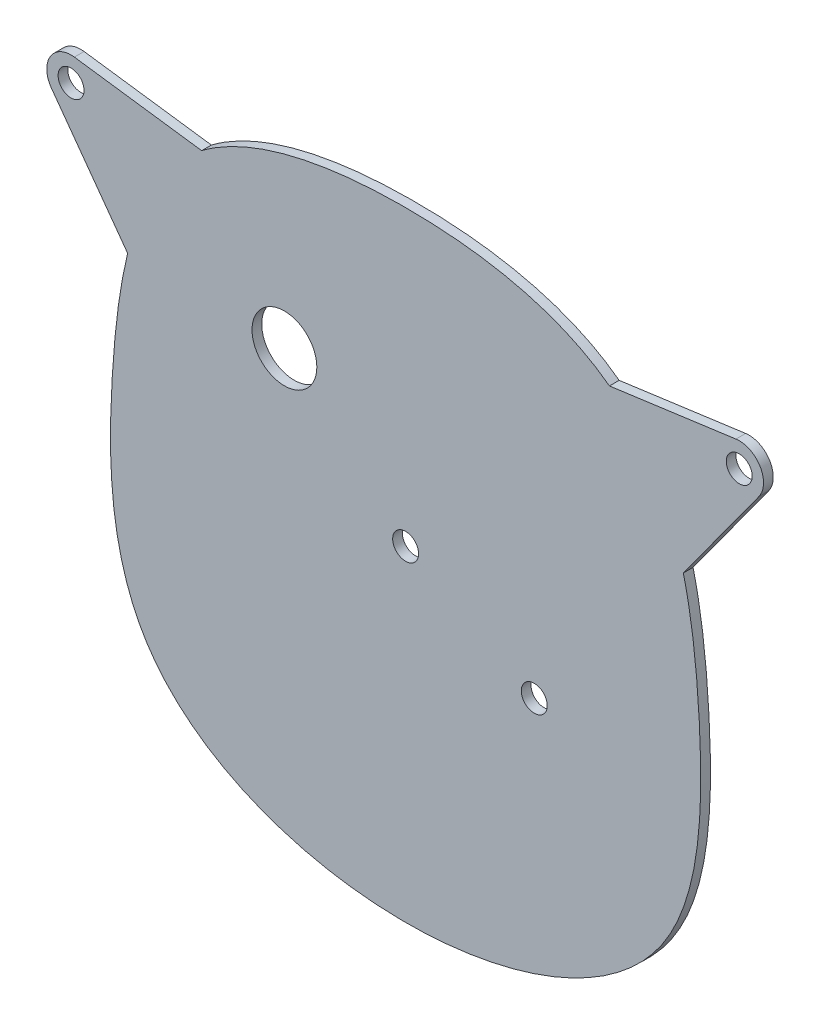
ISO-10303-21;
HEADER;
FILE_DESCRIPTION(('STEP AP214'),'2;1');
FILE_NAME('part.step','',(''),(''),'','','');
FILE_SCHEMA(('AUTOMOTIVE_DESIGN { 1 0 10303 214 1 1 1 1 }'));
ENDSEC;
DATA;
#1=APPLICATION_CONTEXT('core data for automotive mechanical design processes');
#2=APPLICATION_PROTOCOL_DEFINITION('international standard','automotive_design',2000,#1);
#3=PRODUCT_CONTEXT('',#1,'mechanical');
#4=PRODUCT('Part','Part','',(#3));
#5=PRODUCT_RELATED_PRODUCT_CATEGORY('part','',(#4));
#6=PRODUCT_DEFINITION_FORMATION('','',#4);
#7=PRODUCT_DEFINITION_CONTEXT('part definition',#1,'design');
#8=PRODUCT_DEFINITION('design','',#6,#7);
#9=PRODUCT_DEFINITION_SHAPE('','',#8);
#10=(LENGTH_UNIT() NAMED_UNIT(*) SI_UNIT(.MILLI.,.METRE.));
#11=(NAMED_UNIT(*) PLANE_ANGLE_UNIT() SI_UNIT($,.RADIAN.));
#12=(NAMED_UNIT(*) SI_UNIT($,.STERADIAN.) SOLID_ANGLE_UNIT());
#13=UNCERTAINTY_MEASURE_WITH_UNIT(LENGTH_MEASURE(1.E-05),#10,'distance_accuracy_value','');
#14=(GEOMETRIC_REPRESENTATION_CONTEXT(3) GLOBAL_UNCERTAINTY_ASSIGNED_CONTEXT((#13)) GLOBAL_UNIT_ASSIGNED_CONTEXT((#10,
#11,#12)) REPRESENTATION_CONTEXT('',''));
#15=CARTESIAN_POINT('',(0.,0.,0.));
#16=DIRECTION('',(0.,0.,1.));
#17=DIRECTION('',(1.,0.,0.));
#18=AXIS2_PLACEMENT_3D('',#15,#16,#17);
#19=CARTESIAN_POINT('',(-0.0327154369396773,90.4999972819778,3.));
#20=DIRECTION('',(0.,0.,1.));
#21=DIRECTION('',(1.,0.,0.));
#22=AXIS2_PLACEMENT_3D('',#19,#20,#21);
#23=PLANE('',#22);
#24=CARTESIAN_POINT('',(102.908582862489,72.175850638701,3.));
#25=DIRECTION('',(0.,0.,1.));
#26=DIRECTION('',(1.,0.,0.));
#27=AXIS2_PLACEMENT_3D('',#24,#25,#26);
#28=CIRCLE('',#27,4.00000000000001);
#29=CARTESIAN_POINT('',(106.908582862489,72.175850638701,3.));
#30=VERTEX_POINT('',#29);
#31=EDGE_CURVE('E341',#30,#30,#28,.T.);
#32=ORIENTED_EDGE('',*,*,#31,.F.);
#33=EDGE_LOOP('',(#32));
#34=FACE_BOUND('',#33,.T.);
#35=CARTESIAN_POINT('',(39.6858708528769,-20.7491050731684,3.));
#36=DIRECTION('',(0.,0.,1.));
#37=DIRECTION('',(1.,0.,0.));
#38=AXIS2_PLACEMENT_3D('',#35,#36,#37);
#39=CIRCLE('',#38,4.00000001157386);
#40=CARTESIAN_POINT('',(43.6858708644508,-20.7491050731684,3.));
#41=VERTEX_POINT('',#40);
#42=EDGE_CURVE('E353',#41,#41,#39,.T.);
#43=ORIENTED_EDGE('',*,*,#42,.F.);
#44=EDGE_LOOP('',(#43));
#45=FACE_BOUND('',#44,.T.);
#46=CARTESIAN_POINT('',(62.8762438545256,74.2801188358664,3.));
#47=CARTESIAN_POINT('',(60.912957083713,75.7596971631363,3.));
#48=CARTESIAN_POINT('',(53.8348070525263,80.3913999196822,3.));
#49=CARTESIAN_POINT('',(39.8914002075275,86.0513687516967,3.));
#50=CARTESIAN_POINT('',(20.4499330425596,89.792551580246,3.));
#51=CARTESIAN_POINT('',(6.8166443525278,90.4999999982218,3.));
#52=CARTESIAN_POINT('',(7.51189696561824E-09,90.4999999982218,3.));
#53=CARTESIAN_POINT('',(-6.81664433750401,90.4999999982217,3.));
#54=CARTESIAN_POINT('',(-20.4499330275358,89.792551580246,3.));
#55=CARTESIAN_POINT('',(-39.8914001925037,86.0513687516968,3.));
#56=CARTESIAN_POINT('',(-53.8532873320144,80.3838983175194,3.));
#57=CARTESIAN_POINT('',(-60.9449823018761,75.7387305417198,3.));
#58=CARTESIAN_POINT('',(-62.9217351817986,74.2457986481925,3.));
#59=B_SPLINE_CURVE_WITH_KNOTS('',3,(#46,#47,#48,#49,#50,#51,#52,#53,#54,#55,#56,#57,#58),
.UNSPECIFIED.,.F.,.F.,(4,1,1,1,3,1,1,1,4),(0.893210136455456,0.90615001359331,0.93740001359331,
0.96865001359331,0.99990001359331,1.03115001359331,1.06240001359331,1.09365001359331,
1.10668987713785),.UNSPECIFIED.);
#60=CARTESIAN_POINT('',(62.8762438545256,74.2801188358664,3.));
#61=VERTEX_POINT('',#60);
#62=CARTESIAN_POINT('',(-62.9217351817986,74.2457986481925,3.));
#63=VERTEX_POINT('',#62);
#64=EDGE_CURVE('E158',#61,#63,#59,.T.);
#65=ORIENTED_EDGE('',*,*,#64,.T.);
#66=DIRECTION('',(-0.990809124231326,0.135267436362018,0.));
#67=VECTOR('',#66,1.);
#68=CARTESIAN_POINT('',(-62.9217351817986,74.2457986481925,3.));
#69=LINE('',#68,#67);
#70=CARTESIAN_POINT('',(-102.190957477593,79.6069190678326,3.));
#71=VERTEX_POINT('',#70);
#72=EDGE_CURVE('E96',#63,#71,#69,.T.);
#73=ORIENTED_EDGE('',*,*,#72,.T.);
#74=CARTESIAN_POINT('',(-103.205463250444,72.1758506351004,3.));
#75=DIRECTION('',(0.,0.,1.));
#76=DIRECTION('',(1.,0.,0.));
#77=AXIS2_PLACEMENT_3D('',#74,#75,#76);
#78=CIRCLE('',#77,7.50000000100651);
#79=CARTESIAN_POINT('',(-109.27197879626,67.7659312313616,3.));
#80=VERTEX_POINT('',#79);
#81=EDGE_CURVE('E173',#71,#80,#78,.T.);
#82=ORIENTED_EDGE('',*,*,#81,.T.);
#83=DIRECTION('',(0.58798925375293,-0.808868739333566,0.));
#84=VECTOR('',#83,1.);
#85=CARTESIAN_POINT('',(-109.27197879626,67.7659312313616,3.));
#86=LINE('',#85,#84);
#87=CARTESIAN_POINT('',(-85.7485273100174,35.4058422892483,3.));
#88=VERTEX_POINT('',#87);
#89=EDGE_CURVE('E186',#80,#88,#86,.T.);
#90=ORIENTED_EDGE('',*,*,#89,.T.);
#91=CARTESIAN_POINT('',(-85.7485273100174,35.4058422892483,3.));
#92=CARTESIAN_POINT('',(-85.8260695634134,35.0881431318202,3.));
#93=CARTESIAN_POINT('',(-87.4000054212233,28.5262371215663,3.));
#94=CARTESIAN_POINT('',(-89.0071731517559,18.4009767284961,3.));
#95=CARTESIAN_POINT('',(-90.213980034131,5.05235490959758,3.));
#96=CARTESIAN_POINT('',(-91.0234254638618,-8.30015500442403,3.));
#97=CARTESIAN_POINT('',(-91.2490871876281,-24.8802980300265,3.));
#98=CARTESIAN_POINT('',(-89.4828065297775,-40.6688774173827,3.));
#99=CARTESIAN_POINT('',(-86.3144077145121,-52.4436579062583,3.));
#100=CARTESIAN_POINT('',(-82.9150986038872,-60.7386579295448,3.));
#101=CARTESIAN_POINT('',(-78.3184745352951,-68.3854206263171,3.));
#102=CARTESIAN_POINT('',(-70.5643101560197,-77.478782388962,3.));
#103=CARTESIAN_POINT('',(-58.2919739431699,-86.7783101700569,3.));
#104=CARTESIAN_POINT('',(-40.530617691322,-94.6998839122256,3.));
#105=CARTESIAN_POINT('',(-20.766532655849,-99.4438114597044,3.));
#106=CARTESIAN_POINT('',(7.51189313956615E-09,-101.028094272815,3.));
#107=CARTESIAN_POINT('',(20.7665326708728,-99.4438114597044,3.));
#108=CARTESIAN_POINT('',(40.5306177063458,-94.6998839122256,3.));
#109=CARTESIAN_POINT('',(58.2919739581937,-86.7783101700569,3.));
#110=CARTESIAN_POINT('',(70.5643101710435,-77.478782388962,3.));
#111=CARTESIAN_POINT('',(78.3184745503189,-68.3854206263171,3.));
#112=CARTESIAN_POINT('',(82.915098618911,-60.7386579295448,3.));
#113=CARTESIAN_POINT('',(86.3144077295359,-52.4436579062583,3.));
#114=CARTESIAN_POINT('',(89.4828065448013,-40.6688774173828,3.));
#115=CARTESIAN_POINT('',(91.2490872026519,-24.8802980300265,3.));
#116=CARTESIAN_POINT('',(91.0234254788856,-8.30015500442406,3.));
#117=CARTESIAN_POINT('',(90.2139800491548,5.05235490959753,3.));
#118=CARTESIAN_POINT('',(89.0071731667797,18.400976728496,3.));
#119=CARTESIAN_POINT('',(87.3830631796312,28.6329744313218,3.));
#120=CARTESIAN_POINT('',(85.7769815758725,35.2922345868708,3.));
#121=CARTESIAN_POINT('',(85.6735919651475,35.7111614831557,3.));
#122=B_SPLINE_CURVE_WITH_KNOTS('',3,(#91,#92,#93,#94,#95,#96,#97,#98,#99,#100,#101,#102,#103,
#104,#105,#106,#107,#108,#109,#110,#111,#112,#113,#114,#115,#116,#117,#118,#119,#120,#121),
.UNSPECIFIED.,.F.,.F.,(4,1,1,1,1,1,1,1,1,1,1,1,1,1,1,1,1,1,1,1,1,1,1,1,1,1,1,1,4),
(1.18539525333421,1.18698905711832,1.21823905711832,1.23386405711832,1.24948905711832,
1.28073905711832,1.31198905711832,1.32761405711832,1.34323905711832,1.35886405711832,
1.37448905711832,1.40573905711832,1.43698905711832,1.46823905711832,1.49948905711832,
1.53073905711832,1.56198905711832,1.59323905711832,1.62448905711832,1.64011405711832,
1.65573905711832,1.67136405711832,1.68698905711832,1.71823905711832,1.74948905711832,
1.76511405711832,1.78073905711832,1.81198905711832,1.81409380378411),.UNSPECIFIED.);
#123=CARTESIAN_POINT('',(85.6735919651475,35.7111614831557,3.));
#124=VERTEX_POINT('',#123);
#125=EDGE_CURVE('E115',#88,#124,#122,.T.);
#126=ORIENTED_EDGE('',*,*,#125,.T.);
#127=DIRECTION('',(0.58798925364388,0.808868739412838,0.));
#128=VECTOR('',#127,1.);
#129=CARTESIAN_POINT('',(108.97509840264,67.7659312288793,3.));
#130=LINE('',#129,#128);
#131=CARTESIAN_POINT('',(108.97509840264,67.7659312288793,3.));
#132=VERTEX_POINT('',#131);
#133=EDGE_CURVE('E109',#124,#132,#130,.T.);
#134=ORIENTED_EDGE('',*,*,#133,.T.);
#135=CARTESIAN_POINT('',(102.908582862489,72.175850638701,3.));
#136=DIRECTION('',(0.,0.,1.));
#137=DIRECTION('',(1.,0.,0.));
#138=AXIS2_PLACEMENT_3D('',#135,#136,#137);
#139=CIRCLE('',#138,7.5000000000005);
#140=CARTESIAN_POINT('',(101.894077084091,79.6069190696606,3.));
#141=VERTEX_POINT('',#140);
#142=EDGE_CURVE('E113',#132,#141,#139,.T.);
#143=ORIENTED_EDGE('',*,*,#142,.T.);
#144=DIRECTION('',(-0.990809124227078,-0.135267436393135,0.));
#145=VECTOR('',#144,1.);
#146=CARTESIAN_POINT('',(62.8762438545256,74.2801188358664,3.));
#147=LINE('',#146,#145);
#148=EDGE_CURVE('E53',#141,#61,#147,.T.);
#149=ORIENTED_EDGE('',*,*,#148,.T.);
#150=EDGE_LOOP('',(#65,#73,#82,#90,#126,#134,#143,#149));
#151=FACE_BOUND('',#150,.T.);
#152=CARTESIAN_POINT('',(0.,0.,3.));
#153=DIRECTION('',(0.,0.,1.));
#154=DIRECTION('',(1.,0.,0.));
#155=AXIS2_PLACEMENT_3D('',#152,#153,#154);
#156=CIRCLE('',#155,4.);
#157=CARTESIAN_POINT('',(4.,0.,3.));
#158=VERTEX_POINT('',#157);
#159=EDGE_CURVE('E139',#158,#158,#156,.T.);
#160=ORIENTED_EDGE('',*,*,#159,.F.);
#161=EDGE_LOOP('',(#160));
#162=FACE_BOUND('',#161,.T.);
#163=CARTESIAN_POINT('',(-103.205463250444,72.1758506351004,3.));
#164=DIRECTION('',(0.,0.,1.));
#165=DIRECTION('',(1.,0.,0.));
#166=AXIS2_PLACEMENT_3D('',#163,#164,#165);
#167=CIRCLE('',#166,4.00000000000001);
#168=CARTESIAN_POINT('',(-99.2054632504445,72.1758506351004,3.));
#169=VERTEX_POINT('',#168);
#170=EDGE_CURVE('E347',#169,#169,#167,.T.);
#171=ORIENTED_EDGE('',*,*,#170,.F.);
#172=EDGE_LOOP('',(#171));
#173=FACE_BOUND('',#172,.T.);
#174=CARTESIAN_POINT('',(-37.3875325615152,34.1758506370626,3.));
#175=DIRECTION('',(0.,0.,1.));
#176=DIRECTION('',(1.,0.,0.));
#177=AXIS2_PLACEMENT_3D('',#174,#175,#176);
#178=CIRCLE('',#177,10.);
#179=CARTESIAN_POINT('',(-27.3875325615151,34.1758506370626,3.));
#180=VERTEX_POINT('',#179);
#181=EDGE_CURVE('E332',#180,#180,#178,.T.);
#182=ORIENTED_EDGE('',*,*,#181,.F.);
#183=EDGE_LOOP('',(#182));
#184=FACE_BOUND('',#183,.T.);
#185=ADVANCED_FACE('F35',(#34,#45,#151,#162,#173,#184),#23,.T.);
#186=CARTESIAN_POINT('',(-0.0327154369396773,90.4999972819778,0.));
#187=DIRECTION('',(0.,0.,1.));
#188=DIRECTION('',(1.,0.,0.));
#189=AXIS2_PLACEMENT_3D('',#186,#187,#188);
#190=PLANE('',#189);
#191=CARTESIAN_POINT('',(62.8762438545256,74.2801188358664,0.));
#192=CARTESIAN_POINT('',(60.912957083713,75.7596971631363,0.));
#193=CARTESIAN_POINT('',(53.8348070525263,80.3913999196822,0.));
#194=CARTESIAN_POINT('',(39.8914002075275,86.0513687516967,0.));
#195=CARTESIAN_POINT('',(20.4499330425596,89.792551580246,0.));
#196=CARTESIAN_POINT('',(6.8166443525278,90.4999999982218,0.));
#197=CARTESIAN_POINT('',(7.51189696561824E-09,90.4999999982218,0.));
#198=CARTESIAN_POINT('',(-6.81664433750401,90.4999999982217,0.));
#199=CARTESIAN_POINT('',(-20.4499330275358,89.792551580246,0.));
#200=CARTESIAN_POINT('',(-39.8914001925037,86.0513687516968,0.));
#201=CARTESIAN_POINT('',(-53.8532873320144,80.3838983175194,0.));
#202=CARTESIAN_POINT('',(-60.9449823018761,75.7387305417198,0.));
#203=CARTESIAN_POINT('',(-62.9217351817986,74.2457986481925,0.));
#204=B_SPLINE_CURVE_WITH_KNOTS('',3,(#191,#192,#193,#194,#195,#196,#197,#198,#199,#200,#201,
#202,#203),.UNSPECIFIED.,.F.,.F.,(4,1,1,1,3,1,1,1,4),(0.893210136455456,0.90615001359331,
0.93740001359331,0.96865001359331,0.99990001359331,1.03115001359331,1.06240001359331,
1.09365001359331,1.10668987713785),.UNSPECIFIED.);
#205=CARTESIAN_POINT('',(62.8762438545256,74.2801188358664,0.));
#206=VERTEX_POINT('',#205);
#207=CARTESIAN_POINT('',(-62.9217351817986,74.2457986481925,0.));
#208=VERTEX_POINT('',#207);
#209=EDGE_CURVE('E133',#206,#208,#204,.T.);
#210=ORIENTED_EDGE('',*,*,#209,.F.);
#211=DIRECTION('',(-0.990809124227078,-0.135267436393135,0.));
#212=VECTOR('',#211,1.);
#213=CARTESIAN_POINT('',(62.8762438545256,74.2801188358664,0.));
#214=LINE('',#213,#212);
#215=CARTESIAN_POINT('',(101.894077084091,79.6069190696606,0.));
#216=VERTEX_POINT('',#215);
#217=EDGE_CURVE('E88',#216,#206,#214,.T.);
#218=ORIENTED_EDGE('',*,*,#217,.F.);
#219=CARTESIAN_POINT('',(102.908582862489,72.175850638701,0.));
#220=DIRECTION('',(0.,0.,1.));
#221=DIRECTION('',(1.,0.,0.));
#222=AXIS2_PLACEMENT_3D('',#219,#220,#221);
#223=CIRCLE('',#222,7.5000000000005);
#224=CARTESIAN_POINT('',(108.97509840264,67.7659312288793,0.));
#225=VERTEX_POINT('',#224);
#226=EDGE_CURVE('E82',#225,#216,#223,.T.);
#227=ORIENTED_EDGE('',*,*,#226,.F.);
#228=DIRECTION('',(0.58798925364388,0.808868739412838,0.));
#229=VECTOR('',#228,1.);
#230=CARTESIAN_POINT('',(108.97509840264,67.7659312288793,0.));
#231=LINE('',#230,#229);
#232=CARTESIAN_POINT('',(85.6735919651475,35.7111614831557,0.));
#233=VERTEX_POINT('',#232);
#234=EDGE_CURVE('E123',#233,#225,#231,.T.);
#235=ORIENTED_EDGE('',*,*,#234,.F.);
#236=CARTESIAN_POINT('',(-85.7485273100174,35.4058422892483,0.));
#237=CARTESIAN_POINT('',(-85.8260695634134,35.0881431318202,0.));
#238=CARTESIAN_POINT('',(-87.4000054212233,28.5262371215663,0.));
#239=CARTESIAN_POINT('',(-89.0071731517559,18.4009767284961,0.));
#240=CARTESIAN_POINT('',(-90.213980034131,5.05235490959758,0.));
#241=CARTESIAN_POINT('',(-91.0234254638618,-8.30015500442403,0.));
#242=CARTESIAN_POINT('',(-91.2490871876281,-24.8802980300265,0.));
#243=CARTESIAN_POINT('',(-89.4828065297775,-40.6688774173827,0.));
#244=CARTESIAN_POINT('',(-86.3144077145121,-52.4436579062583,0.));
#245=CARTESIAN_POINT('',(-82.9150986038872,-60.7386579295448,0.));
#246=CARTESIAN_POINT('',(-78.3184745352951,-68.3854206263171,0.));
#247=CARTESIAN_POINT('',(-70.5643101560197,-77.478782388962,0.));
#248=CARTESIAN_POINT('',(-58.2919739431699,-86.7783101700569,0.));
#249=CARTESIAN_POINT('',(-40.530617691322,-94.6998839122256,0.));
#250=CARTESIAN_POINT('',(-20.766532655849,-99.4438114597044,0.));
#251=CARTESIAN_POINT('',(7.51189313956615E-09,-101.028094272815,0.));
#252=CARTESIAN_POINT('',(20.7665326708728,-99.4438114597044,0.));
#253=CARTESIAN_POINT('',(40.5306177063458,-94.6998839122256,0.));
#254=CARTESIAN_POINT('',(58.2919739581937,-86.7783101700569,0.));
#255=CARTESIAN_POINT('',(70.5643101710435,-77.478782388962,0.));
#256=CARTESIAN_POINT('',(78.3184745503189,-68.3854206263171,0.));
#257=CARTESIAN_POINT('',(82.915098618911,-60.7386579295448,0.));
#258=CARTESIAN_POINT('',(86.3144077295359,-52.4436579062583,0.));
#259=CARTESIAN_POINT('',(89.4828065448013,-40.6688774173828,0.));
#260=CARTESIAN_POINT('',(91.2490872026519,-24.8802980300265,0.));
#261=CARTESIAN_POINT('',(91.0234254788856,-8.30015500442406,0.));
#262=CARTESIAN_POINT('',(90.2139800491548,5.05235490959753,0.));
#263=CARTESIAN_POINT('',(89.0071731667797,18.400976728496,0.));
#264=CARTESIAN_POINT('',(87.3830631796312,28.6329744313218,0.));
#265=CARTESIAN_POINT('',(85.7769815758725,35.2922345868708,0.));
#266=CARTESIAN_POINT('',(85.6735919651475,35.7111614831557,0.));
#267=B_SPLINE_CURVE_WITH_KNOTS('',3,(#236,#237,#238,#239,#240,#241,#242,#243,#244,#245,#246,
#247,#248,#249,#250,#251,#252,#253,#254,#255,#256,#257,#258,#259,#260,#261,#262,#263,#264,#265,
#266),.UNSPECIFIED.,.F.,.F.,(4,1,1,1,1,1,1,1,1,1,1,1,1,1,1,1,1,1,1,1,1,1,1,1,1,1,1,1,4),
(1.18539525333421,1.18698905711832,1.21823905711832,1.23386405711832,1.24948905711832,
1.28073905711832,1.31198905711832,1.32761405711832,1.34323905711832,1.35886405711832,
1.37448905711832,1.40573905711832,1.43698905711832,1.46823905711832,1.49948905711832,
1.53073905711832,1.56198905711832,1.59323905711832,1.62448905711832,1.64011405711832,
1.65573905711832,1.67136405711832,1.68698905711832,1.71823905711832,1.74948905711832,
1.76511405711832,1.78073905711832,1.81198905711832,1.81409380378411),.UNSPECIFIED.);
#268=CARTESIAN_POINT('',(-85.7485273100174,35.4058422892483,0.));
#269=VERTEX_POINT('',#268);
#270=EDGE_CURVE('E148',#269,#233,#267,.T.);
#271=ORIENTED_EDGE('',*,*,#270,.F.);
#272=DIRECTION('',(0.58798925375293,-0.808868739333566,0.));
#273=VECTOR('',#272,1.);
#274=CARTESIAN_POINT('',(-109.27197879626,67.7659312313616,0.));
#275=LINE('',#274,#273);
#276=CARTESIAN_POINT('',(-109.27197879626,67.7659312313616,0.));
#277=VERTEX_POINT('',#276);
#278=EDGE_CURVE('E146',#277,#269,#275,.T.);
#279=ORIENTED_EDGE('',*,*,#278,.F.);
#280=CARTESIAN_POINT('',(-103.205463250444,72.1758506351004,0.));
#281=DIRECTION('',(0.,0.,1.));
#282=DIRECTION('',(1.,0.,0.));
#283=AXIS2_PLACEMENT_3D('',#280,#281,#282);
#284=CIRCLE('',#283,7.50000000100651);
#285=CARTESIAN_POINT('',(-102.190957477593,79.6069190678326,0.));
#286=VERTEX_POINT('',#285);
#287=EDGE_CURVE('E144',#286,#277,#284,.T.);
#288=ORIENTED_EDGE('',*,*,#287,.F.);
#289=DIRECTION('',(-0.990809124231326,0.135267436362018,0.));
#290=VECTOR('',#289,1.);
#291=CARTESIAN_POINT('',(-62.9217351817986,74.2457986481925,0.));
#292=LINE('',#291,#290);
#293=EDGE_CURVE('E138',#208,#286,#292,.T.);
#294=ORIENTED_EDGE('',*,*,#293,.F.);
#295=EDGE_LOOP('',(#210,#218,#227,#235,#271,#279,#288,#294));
#296=FACE_BOUND('',#295,.T.);
#297=CARTESIAN_POINT('',(0.,0.,0.));
#298=DIRECTION('',(0.,0.,1.));
#299=DIRECTION('',(1.,0.,0.));
#300=AXIS2_PLACEMENT_3D('',#297,#298,#299);
#301=CIRCLE('',#300,4.);
#302=CARTESIAN_POINT('',(4.,0.,0.));
#303=VERTEX_POINT('',#302);
#304=EDGE_CURVE('E356',#303,#303,#301,.T.);
#305=ORIENTED_EDGE('',*,*,#304,.T.);
#306=EDGE_LOOP('',(#305));
#307=FACE_BOUND('',#306,.T.);
#308=CARTESIAN_POINT('',(39.6858708528769,-20.7491050731684,0.));
#309=DIRECTION('',(0.,0.,1.));
#310=DIRECTION('',(1.,0.,0.));
#311=AXIS2_PLACEMENT_3D('',#308,#309,#310);
#312=CIRCLE('',#311,4.00000001157386);
#313=CARTESIAN_POINT('',(43.6858708644508,-20.7491050731684,0.));
#314=VERTEX_POINT('',#313);
#315=EDGE_CURVE('E350',#314,#314,#312,.T.);
#316=ORIENTED_EDGE('',*,*,#315,.T.);
#317=EDGE_LOOP('',(#316));
#318=FACE_BOUND('',#317,.T.);
#319=CARTESIAN_POINT('',(-103.205463250444,72.1758506351004,0.));
#320=DIRECTION('',(0.,0.,1.));
#321=DIRECTION('',(1.,0.,0.));
#322=AXIS2_PLACEMENT_3D('',#319,#320,#321);
#323=CIRCLE('',#322,4.00000000000001);
#324=CARTESIAN_POINT('',(-99.2054632504445,72.1758506351004,0.));
#325=VERTEX_POINT('',#324);
#326=EDGE_CURVE('E344',#325,#325,#323,.T.);
#327=ORIENTED_EDGE('',*,*,#326,.T.);
#328=EDGE_LOOP('',(#327));
#329=FACE_BOUND('',#328,.T.);
#330=CARTESIAN_POINT('',(102.908582862489,72.175850638701,0.));
#331=DIRECTION('',(0.,0.,1.));
#332=DIRECTION('',(1.,0.,0.));
#333=AXIS2_PLACEMENT_3D('',#330,#331,#332);
#334=CIRCLE('',#333,4.00000000000001);
#335=CARTESIAN_POINT('',(106.908582862489,72.175850638701,0.));
#336=VERTEX_POINT('',#335);
#337=EDGE_CURVE('E338',#336,#336,#334,.T.);
#338=ORIENTED_EDGE('',*,*,#337,.T.);
#339=EDGE_LOOP('',(#338));
#340=FACE_BOUND('',#339,.T.);
#341=CARTESIAN_POINT('',(-37.3875325615152,34.1758506370626,0.));
#342=DIRECTION('',(0.,0.,1.));
#343=DIRECTION('',(1.,0.,0.));
#344=AXIS2_PLACEMENT_3D('',#341,#342,#343);
#345=CIRCLE('',#344,10.);
#346=CARTESIAN_POINT('',(-27.3875325615151,34.1758506370626,0.));
#347=VERTEX_POINT('',#346);
#348=EDGE_CURVE('E335',#347,#347,#345,.T.);
#349=ORIENTED_EDGE('',*,*,#348,.T.);
#350=EDGE_LOOP('',(#349));
#351=FACE_BOUND('',#350,.T.);
#352=ADVANCED_FACE('F177',(#296,#307,#318,#329,#340,#351),#190,.F.);
#353=DIRECTION('',(0.,0.,-1.));
#354=VECTOR('',#353,1.);
#355=SURFACE_OF_LINEAR_EXTRUSION('',#59,#354);
#356=ORIENTED_EDGE('',*,*,#209,.T.);
#357=DIRECTION('',(0.,0.,-1.));
#358=VECTOR('',#357,1.);
#359=CARTESIAN_POINT('',(-62.9217351817986,74.2457986481925,3.));
#360=LINE('',#359,#358);
#361=EDGE_CURVE('E11',#63,#208,#360,.T.);
#362=ORIENTED_EDGE('',*,*,#361,.F.);
#363=ORIENTED_EDGE('',*,*,#64,.F.);
#364=DIRECTION('',(0.,0.,-1.));
#365=VECTOR('',#364,1.);
#366=CARTESIAN_POINT('',(62.8762438545256,74.2801188358664,3.));
#367=LINE('',#366,#365);
#368=EDGE_CURVE('E129',#61,#206,#367,.T.);
#369=ORIENTED_EDGE('',*,*,#368,.T.);
#370=EDGE_LOOP('',(#356,#362,#363,#369));
#371=FACE_BOUND('',#370,.T.);
#372=ADVANCED_FACE('F37',(#371),#355,.F.);
#373=CARTESIAN_POINT('',(-62.9217351817986,74.2457986481925,3.));
#374=DIRECTION('',(-0.135267436362018,-0.990809124231326,0.));
#375=DIRECTION('',(0.990809124231326,-0.135267436362018,0.));
#376=AXIS2_PLACEMENT_3D('',#373,#374,#375);
#377=PLANE('',#376);
#378=ORIENTED_EDGE('',*,*,#293,.T.);
#379=DIRECTION('',(0.,0.,-1.));
#380=VECTOR('',#379,1.);
#381=CARTESIAN_POINT('',(-102.190957477593,79.6069190678326,3.));
#382=LINE('',#381,#380);
#383=EDGE_CURVE('E45',#71,#286,#382,.T.);
#384=ORIENTED_EDGE('',*,*,#383,.F.);
#385=ORIENTED_EDGE('',*,*,#72,.F.);
#386=ORIENTED_EDGE('',*,*,#361,.T.);
#387=EDGE_LOOP('',(#378,#384,#385,#386));
#388=FACE_BOUND('',#387,.T.);
#389=ADVANCED_FACE('F203',(#388),#377,.F.);
#390=CARTESIAN_POINT('',(-103.205463250444,72.1758506351004,3.));
#391=DIRECTION('',(0.,0.,-1.));
#392=DIRECTION('',(-1.,0.,0.));
#393=AXIS2_PLACEMENT_3D('',#390,#391,#392);
#394=CYLINDRICAL_SURFACE('',#393,7.50000000100651);
#395=ORIENTED_EDGE('',*,*,#287,.T.);
#396=DIRECTION('',(0.,0.,-1.));
#397=VECTOR('',#396,1.);
#398=CARTESIAN_POINT('',(-109.27197879626,67.7659312313616,3.));
#399=LINE('',#398,#397);
#400=EDGE_CURVE('E165',#80,#277,#399,.T.);
#401=ORIENTED_EDGE('',*,*,#400,.F.);
#402=ORIENTED_EDGE('',*,*,#81,.F.);
#403=ORIENTED_EDGE('',*,*,#383,.T.);
#404=EDGE_LOOP('',(#395,#401,#402,#403));
#405=FACE_BOUND('',#404,.T.);
#406=ADVANCED_FACE('F171',(#405),#394,.T.);
#407=CARTESIAN_POINT('',(-109.27197879626,67.7659312313616,3.));
#408=DIRECTION('',(0.808868739333566,0.58798925375293,0.));
#409=DIRECTION('',(-0.58798925375293,0.808868739333566,0.));
#410=AXIS2_PLACEMENT_3D('',#407,#408,#409);
#411=PLANE('',#410);
#412=ORIENTED_EDGE('',*,*,#278,.T.);
#413=DIRECTION('',(0.,0.,-1.));
#414=VECTOR('',#413,1.);
#415=CARTESIAN_POINT('',(-85.7485273100174,35.4058422892483,3.));
#416=LINE('',#415,#414);
#417=EDGE_CURVE('E162',#88,#269,#416,.T.);
#418=ORIENTED_EDGE('',*,*,#417,.F.);
#419=ORIENTED_EDGE('',*,*,#89,.F.);
#420=ORIENTED_EDGE('',*,*,#400,.T.);
#421=EDGE_LOOP('',(#412,#418,#419,#420));
#422=FACE_BOUND('',#421,.T.);
#423=ADVANCED_FACE('F182',(#422),#411,.F.);
#424=DIRECTION('',(0.,0.,-1.));
#425=VECTOR('',#424,1.);
#426=SURFACE_OF_LINEAR_EXTRUSION('',#122,#425);
#427=ORIENTED_EDGE('',*,*,#270,.T.);
#428=DIRECTION('',(0.,0.,-1.));
#429=VECTOR('',#428,1.);
#430=CARTESIAN_POINT('',(85.6735919651475,35.7111614831557,3.));
#431=LINE('',#430,#429);
#432=EDGE_CURVE('E124',#124,#233,#431,.T.);
#433=ORIENTED_EDGE('',*,*,#432,.F.);
#434=ORIENTED_EDGE('',*,*,#125,.F.);
#435=ORIENTED_EDGE('',*,*,#417,.T.);
#436=EDGE_LOOP('',(#427,#433,#434,#435));
#437=FACE_BOUND('',#436,.T.);
#438=ADVANCED_FACE('F185',(#437),#426,.F.);
#439=CARTESIAN_POINT('',(108.97509840264,67.7659312288793,3.));
#440=DIRECTION('',(-0.808868739412837,0.58798925364388,0.));
#441=DIRECTION('',(-0.58798925364388,-0.808868739412838,0.));
#442=AXIS2_PLACEMENT_3D('',#439,#440,#441);
#443=PLANE('',#442);
#444=ORIENTED_EDGE('',*,*,#234,.T.);
#445=DIRECTION('',(0.,0.,-1.));
#446=VECTOR('',#445,1.);
#447=CARTESIAN_POINT('',(108.97509840264,67.7659312288793,3.));
#448=LINE('',#447,#446);
#449=EDGE_CURVE('E120',#132,#225,#448,.T.);
#450=ORIENTED_EDGE('',*,*,#449,.F.);
#451=ORIENTED_EDGE('',*,*,#133,.F.);
#452=ORIENTED_EDGE('',*,*,#432,.T.);
#453=EDGE_LOOP('',(#444,#450,#451,#452));
#454=FACE_BOUND('',#453,.T.);
#455=ADVANCED_FACE('F121',(#454),#443,.F.);
#456=CARTESIAN_POINT('',(102.908582862489,72.175850638701,3.));
#457=DIRECTION('',(0.,0.,-1.));
#458=DIRECTION('',(-1.,0.,0.));
#459=AXIS2_PLACEMENT_3D('',#456,#457,#458);
#460=CYLINDRICAL_SURFACE('',#459,7.5000000000005);
#461=ORIENTED_EDGE('',*,*,#226,.T.);
#462=DIRECTION('',(0.,0.,-1.));
#463=VECTOR('',#462,1.);
#464=CARTESIAN_POINT('',(101.894077084091,79.6069190696606,3.));
#465=LINE('',#464,#463);
#466=EDGE_CURVE('E125',#141,#216,#465,.T.);
#467=ORIENTED_EDGE('',*,*,#466,.F.);
#468=ORIENTED_EDGE('',*,*,#142,.F.);
#469=ORIENTED_EDGE('',*,*,#449,.T.);
#470=EDGE_LOOP('',(#461,#467,#468,#469));
#471=FACE_BOUND('',#470,.T.);
#472=ADVANCED_FACE('F127',(#471),#460,.T.);
#473=CARTESIAN_POINT('',(62.8762438545256,74.2801188358664,3.));
#474=DIRECTION('',(0.135267436393135,-0.990809124227078,0.));
#475=DIRECTION('',(0.990809124227078,0.135267436393135,0.));
#476=AXIS2_PLACEMENT_3D('',#473,#474,#475);
#477=PLANE('',#476);
#478=ORIENTED_EDGE('',*,*,#217,.T.);
#479=ORIENTED_EDGE('',*,*,#368,.F.);
#480=ORIENTED_EDGE('',*,*,#148,.F.);
#481=ORIENTED_EDGE('',*,*,#466,.T.);
#482=EDGE_LOOP('',(#478,#479,#480,#481));
#483=FACE_BOUND('',#482,.T.);
#484=ADVANCED_FACE('F222',(#483),#477,.F.);
#485=CARTESIAN_POINT('',(0.,0.,3.));
#486=DIRECTION('',(0.,0.,-1.));
#487=DIRECTION('',(-1.,0.,0.));
#488=AXIS2_PLACEMENT_3D('',#485,#486,#487);
#489=CYLINDRICAL_SURFACE('',#488,4.);
#490=ORIENTED_EDGE('',*,*,#159,.T.);
#491=EDGE_LOOP('',(#490));
#492=FACE_BOUND('',#491,.T.);
#493=ORIENTED_EDGE('',*,*,#304,.F.);
#494=EDGE_LOOP('',(#493));
#495=FACE_BOUND('',#494,.T.);
#496=ADVANCED_FACE('F219',(#492,#495),#489,.F.);
#497=CARTESIAN_POINT('',(39.6858708528769,-20.7491050731684,3.));
#498=DIRECTION('',(0.,0.,-1.));
#499=DIRECTION('',(-1.,0.,0.));
#500=AXIS2_PLACEMENT_3D('',#497,#498,#499);
#501=CYLINDRICAL_SURFACE('',#500,4.00000001157386);
#502=ORIENTED_EDGE('',*,*,#42,.T.);
#503=EDGE_LOOP('',(#502));
#504=FACE_BOUND('',#503,.T.);
#505=ORIENTED_EDGE('',*,*,#315,.F.);
#506=EDGE_LOOP('',(#505));
#507=FACE_BOUND('',#506,.T.);
#508=ADVANCED_FACE('F287',(#504,#507),#501,.F.);
#509=CARTESIAN_POINT('',(-103.205463250444,72.1758506351004,3.));
#510=DIRECTION('',(0.,0.,-1.));
#511=DIRECTION('',(-1.,0.,0.));
#512=AXIS2_PLACEMENT_3D('',#509,#510,#511);
#513=CYLINDRICAL_SURFACE('',#512,4.00000000000001);
#514=ORIENTED_EDGE('',*,*,#170,.T.);
#515=EDGE_LOOP('',(#514));
#516=FACE_BOUND('',#515,.T.);
#517=ORIENTED_EDGE('',*,*,#326,.F.);
#518=EDGE_LOOP('',(#517));
#519=FACE_BOUND('',#518,.T.);
#520=ADVANCED_FACE('F295',(#516,#519),#513,.F.);
#521=CARTESIAN_POINT('',(102.908582862489,72.175850638701,3.));
#522=DIRECTION('',(0.,0.,-1.));
#523=DIRECTION('',(-1.,0.,0.));
#524=AXIS2_PLACEMENT_3D('',#521,#522,#523);
#525=CYLINDRICAL_SURFACE('',#524,4.00000000000001);
#526=ORIENTED_EDGE('',*,*,#31,.T.);
#527=EDGE_LOOP('',(#526));
#528=FACE_BOUND('',#527,.T.);
#529=ORIENTED_EDGE('',*,*,#337,.F.);
#530=EDGE_LOOP('',(#529));
#531=FACE_BOUND('',#530,.T.);
#532=ADVANCED_FACE('F303',(#528,#531),#525,.F.);
#533=CARTESIAN_POINT('',(-37.3875325615152,34.1758506370626,3.));
#534=DIRECTION('',(0.,0.,-1.));
#535=DIRECTION('',(-1.,0.,0.));
#536=AXIS2_PLACEMENT_3D('',#533,#534,#535);
#537=CYLINDRICAL_SURFACE('',#536,10.);
#538=ORIENTED_EDGE('',*,*,#181,.T.);
#539=EDGE_LOOP('',(#538));
#540=FACE_BOUND('',#539,.T.);
#541=ORIENTED_EDGE('',*,*,#348,.F.);
#542=EDGE_LOOP('',(#541));
#543=FACE_BOUND('',#542,.T.);
#544=ADVANCED_FACE('F312',(#540,#543),#537,.F.);
#545=CLOSED_SHELL('',(#185,#352,#372,#389,#406,#423,#438,#455,#472,#484,#496,#508,#520,#532,#544));
#546=MANIFOLD_SOLID_BREP('B2',#545);
#547=ADVANCED_BREP_SHAPE_REPRESENTATION('',(#18,#546),#14);
#548=SHAPE_DEFINITION_REPRESENTATION(#9,#547);
ENDSEC;
END-ISO-10303-21;
